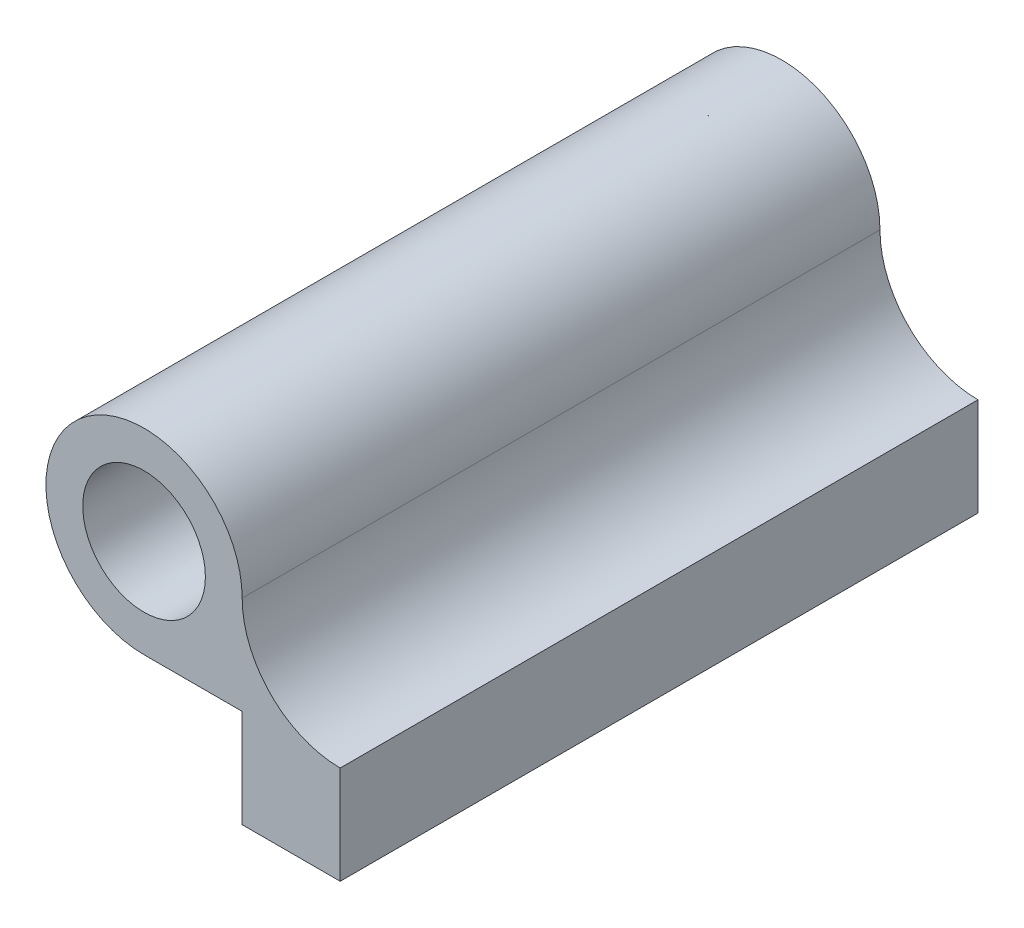
ISO-10303-21;
HEADER;
FILE_DESCRIPTION(('STEP AP214'),'2;1');
FILE_NAME('part.step','',(''),(''),'','','');
FILE_SCHEMA(('AUTOMOTIVE_DESIGN { 1 0 10303 214 1 1 1 1 }'));
ENDSEC;
DATA;
#1=APPLICATION_CONTEXT('core data for automotive mechanical design processes');
#2=APPLICATION_PROTOCOL_DEFINITION('international standard','automotive_design',2000,#1);
#3=PRODUCT_CONTEXT('',#1,'mechanical');
#4=PRODUCT('Part','Part','',(#3));
#5=PRODUCT_RELATED_PRODUCT_CATEGORY('part','',(#4));
#6=PRODUCT_DEFINITION_FORMATION('','',#4);
#7=PRODUCT_DEFINITION_CONTEXT('part definition',#1,'design');
#8=PRODUCT_DEFINITION('design','',#6,#7);
#9=PRODUCT_DEFINITION_SHAPE('','',#8);
#10=(LENGTH_UNIT() NAMED_UNIT(*) SI_UNIT(.MILLI.,.METRE.));
#11=(NAMED_UNIT(*) PLANE_ANGLE_UNIT() SI_UNIT($,.RADIAN.));
#12=(NAMED_UNIT(*) SI_UNIT($,.STERADIAN.) SOLID_ANGLE_UNIT());
#13=UNCERTAINTY_MEASURE_WITH_UNIT(LENGTH_MEASURE(1.E-05),#10,'distance_accuracy_value','');
#14=(GEOMETRIC_REPRESENTATION_CONTEXT(3) GLOBAL_UNCERTAINTY_ASSIGNED_CONTEXT((#13)) GLOBAL_UNIT_ASSIGNED_CONTEXT((#10,
#11,#12)) REPRESENTATION_CONTEXT('',''));
#15=CARTESIAN_POINT('',(0.,0.,0.));
#16=DIRECTION('',(0.,0.,1.));
#17=DIRECTION('',(1.,0.,0.));
#18=AXIS2_PLACEMENT_3D('',#15,#16,#17);
#19=CARTESIAN_POINT('',(7.33716722612504,0.000388335978682196,-11.5573838580648));
#20=DIRECTION('',(0.,0.,1.));
#21=DIRECTION('',(1.,0.,0.));
#22=AXIS2_PLACEMENT_3D('',#19,#20,#21);
#23=CYLINDRICAL_SURFACE('',#22,1.99961170172985);
#24=DIRECTION('',(0.,0.,1.));
#25=VECTOR('',#24,1.);
#26=CARTESIAN_POINT('',(7.33716722612504,2.00000001885427,-11.5573838580648));
#27=LINE('',#26,#25);
#28=CARTESIAN_POINT('',(7.33716722612504,2.,6.4428661419352));
#29=VERTEX_POINT('',#28);
#30=CARTESIAN_POINT('',(7.33716722612504,2.,-6.5571338580648));
#31=VERTEX_POINT('',#30);
#32=EDGE_CURVE('E114',#29,#31,#27,.F.);
#33=ORIENTED_EDGE('',*,*,#32,.F.);
#34=CARTESIAN_POINT('',(7.33716722612504,0.000388335978682196,6.44286614193519));
#35=DIRECTION('',(0.,0.,1.));
#36=DIRECTION('',(1.,0.,0.));
#37=AXIS2_PLACEMENT_3D('',#34,#35,#36);
#38=CIRCLE('',#37,1.99961170172985);
#39=CARTESIAN_POINT('',(7.33677889014635,2.,6.4428661419352));
#40=VERTEX_POINT('',#39);
#41=EDGE_CURVE('E50',#29,#40,#38,.T.);
#42=ORIENTED_EDGE('',*,*,#41,.T.);
#43=DIRECTION('',(0.,0.,1.));
#44=VECTOR('',#43,1.);
#45=CARTESIAN_POINT('',(7.33677889014635,2.,-16.0273685975336));
#46=LINE('',#45,#44);
#47=CARTESIAN_POINT('',(7.33677889014635,2.,-6.55713385806481));
#48=VERTEX_POINT('',#47);
#49=EDGE_CURVE('E153',#48,#40,#46,.T.);
#50=ORIENTED_EDGE('',*,*,#49,.F.);
#51=CARTESIAN_POINT('',(7.33716722612504,0.000388335978682196,-6.5571338580648));
#52=DIRECTION('',(0.,0.,-1.));
#53=DIRECTION('',(-1.,0.,0.));
#54=AXIS2_PLACEMENT_3D('',#51,#52,#53);
#55=CIRCLE('',#54,1.99961170172985);
#56=EDGE_CURVE('E174',#48,#31,#55,.T.);
#57=ORIENTED_EDGE('',*,*,#56,.T.);
#58=EDGE_LOOP('',(#33,#42,#50,#57));
#59=FACE_BOUND('',#58,.T.);
#60=ADVANCED_FACE('F42',(#59),#23,.F.);
#61=CARTESIAN_POINT('',(0.,0.,6.4428661419352));
#62=DIRECTION('',(0.,0.,1.));
#63=DIRECTION('',(1.,0.,0.));
#64=AXIS2_PLACEMENT_3D('',#61,#62,#63);
#65=PLANE('',#64);
#66=DIRECTION('',(-1.,0.,0.));
#67=VECTOR('',#66,1.);
#68=CARTESIAN_POINT('',(0.,2.,6.4428661419352));
#69=LINE('',#68,#67);
#70=CARTESIAN_POINT('',(9.33677889014635,2.,6.44286614193519));
#71=VERTEX_POINT('',#70);
#72=EDGE_CURVE('E133',#71,#29,#69,.T.);
#73=ORIENTED_EDGE('',*,*,#72,.F.);
#74=DIRECTION('',(0.,-1.,0.));
#75=VECTOR('',#74,1.);
#76=CARTESIAN_POINT('',(9.33677889014635,0.,6.4428661419352));
#77=LINE('',#76,#75);
#78=CARTESIAN_POINT('',(9.33677890900062,0.000388335978682196,6.4428661419352));
#79=VERTEX_POINT('',#78);
#80=EDGE_CURVE('E121',#71,#79,#77,.T.);
#81=ORIENTED_EDGE('',*,*,#80,.T.);
#82=CARTESIAN_POINT('',(9.33677889014637,0.,6.44286614193519));
#83=VERTEX_POINT('',#82);
#84=EDGE_CURVE('E11',#83,#79,#38,.T.);
#85=ORIENTED_EDGE('',*,*,#84,.F.);
#86=DIRECTION('',(-1.,0.,0.));
#87=VECTOR('',#86,1.);
#88=CARTESIAN_POINT('',(0.,0.,6.4428661419352));
#89=LINE('',#88,#87);
#90=CARTESIAN_POINT('',(11.334653153546,0.,6.4428661419352));
#91=VERTEX_POINT('',#90);
#92=EDGE_CURVE('E65',#91,#83,#89,.T.);
#93=ORIENTED_EDGE('',*,*,#92,.F.);
#94=DIRECTION('',(0.,-1.,0.));
#95=VECTOR('',#94,1.);
#96=CARTESIAN_POINT('',(11.334653153546,0.,6.4428661419352));
#97=LINE('',#96,#95);
#98=CARTESIAN_POINT('',(11.334653153546,2.,6.44286614193519));
#99=VERTEX_POINT('',#98);
#100=EDGE_CURVE('E146',#99,#91,#97,.T.);
#101=ORIENTED_EDGE('',*,*,#100,.F.);
#102=CARTESIAN_POINT('',(11.3367800210374,4.,6.44286614193519));
#103=DIRECTION('',(0.,0.,1.));
#104=DIRECTION('',(1.,0.,0.));
#105=AXIS2_PLACEMENT_3D('',#102,#103,#104);
#106=CIRCLE('',#105,2.00000113089101);
#107=CARTESIAN_POINT('',(9.33677889014635,4.,6.44286614193519));
#108=VERTEX_POINT('',#107);
#109=EDGE_CURVE('E152',#99,#108,#106,.F.);
#110=ORIENTED_EDGE('',*,*,#109,.T.);
#111=CARTESIAN_POINT('',(7.33677889014635,4.,6.4428661419352));
#112=DIRECTION('',(0.,0.,1.));
#113=DIRECTION('',(1.,0.,0.));
#114=AXIS2_PLACEMENT_3D('',#111,#112,#113);
#115=CIRCLE('',#114,2.);
#116=EDGE_CURVE('E156',#108,#40,#115,.T.);
#117=ORIENTED_EDGE('',*,*,#116,.T.);
#118=ORIENTED_EDGE('',*,*,#41,.F.);
#119=EDGE_LOOP('',(#73,#81,#85,#93,#101,#110,#117,#118));
#120=FACE_BOUND('',#119,.T.);
#121=CARTESIAN_POINT('',(7.33677889014635,4.,6.4428661419352));
#122=DIRECTION('',(0.,0.,1.));
#123=DIRECTION('',(1.,0.,0.));
#124=AXIS2_PLACEMENT_3D('',#121,#122,#123);
#125=CIRCLE('',#124,1.25);
#126=CARTESIAN_POINT('',(8.58677889014635,4.,6.4428661419352));
#127=VERTEX_POINT('',#126);
#128=EDGE_CURVE('E170',#127,#127,#125,.T.);
#129=ORIENTED_EDGE('',*,*,#128,.F.);
#130=EDGE_LOOP('',(#129));
#131=FACE_BOUND('',#130,.T.);
#132=ADVANCED_FACE('F44',(#120,#131),#65,.T.);
#133=CARTESIAN_POINT('',(0.,0.,-6.5571338580648));
#134=DIRECTION('',(0.,0.,-1.));
#135=DIRECTION('',(-1.,0.,0.));
#136=AXIS2_PLACEMENT_3D('',#133,#134,#135);
#137=PLANE('',#136);
#138=DIRECTION('',(1.,0.,0.));
#139=VECTOR('',#138,1.);
#140=CARTESIAN_POINT('',(0.,2.,-6.5571338580648));
#141=LINE('',#140,#139);
#142=CARTESIAN_POINT('',(9.33677889014635,2.,-6.5571338580648));
#143=VERTEX_POINT('',#142);
#144=EDGE_CURVE('E109',#31,#143,#141,.T.);
#145=ORIENTED_EDGE('',*,*,#144,.F.);
#146=ORIENTED_EDGE('',*,*,#56,.F.);
#147=CARTESIAN_POINT('',(7.33677889014635,4.,-6.55713385806481));
#148=DIRECTION('',(0.,0.,-1.));
#149=DIRECTION('',(-1.,0.,0.));
#150=AXIS2_PLACEMENT_3D('',#147,#148,#149);
#151=CIRCLE('',#150,2.);
#152=CARTESIAN_POINT('',(9.33677889014635,4.,-6.5571338580648));
#153=VERTEX_POINT('',#152);
#154=EDGE_CURVE('E164',#48,#153,#151,.T.);
#155=ORIENTED_EDGE('',*,*,#154,.T.);
#156=CARTESIAN_POINT('',(11.3367800210374,4.,-6.5571338580648));
#157=DIRECTION('',(0.,0.,-1.));
#158=DIRECTION('',(-1.,0.,0.));
#159=AXIS2_PLACEMENT_3D('',#156,#157,#158);
#160=CIRCLE('',#159,2.00000113089101);
#161=CARTESIAN_POINT('',(11.334653153546,2.,-6.5571338580648));
#162=VERTEX_POINT('',#161);
#163=EDGE_CURVE('E149',#153,#162,#160,.F.);
#164=ORIENTED_EDGE('',*,*,#163,.T.);
#165=DIRECTION('',(0.,-1.,0.));
#166=VECTOR('',#165,1.);
#167=CARTESIAN_POINT('',(11.334653153546,10.,-6.5571338580648));
#168=LINE('',#167,#166);
#169=CARTESIAN_POINT('',(11.334653153546,0.,-6.5571338580648));
#170=VERTEX_POINT('',#169);
#171=EDGE_CURVE('E143',#162,#170,#168,.T.);
#172=ORIENTED_EDGE('',*,*,#171,.T.);
#173=DIRECTION('',(1.,0.,0.));
#174=VECTOR('',#173,1.);
#175=CARTESIAN_POINT('',(0.,0.,-6.5571338580648));
#176=LINE('',#175,#174);
#177=CARTESIAN_POINT('',(9.33677889014637,0.,-6.5571338580648));
#178=VERTEX_POINT('',#177);
#179=EDGE_CURVE('E138',#178,#170,#176,.T.);
#180=ORIENTED_EDGE('',*,*,#179,.F.);
#181=CARTESIAN_POINT('',(9.33677892785489,0.000388335978682196,-6.5571338580648));
#182=VERTEX_POINT('',#181);
#183=EDGE_CURVE('E128',#182,#178,#55,.T.);
#184=ORIENTED_EDGE('',*,*,#183,.F.);
#185=DIRECTION('',(0.,1.,0.));
#186=VECTOR('',#185,1.);
#187=CARTESIAN_POINT('',(9.33677889014635,0.,-6.5571338580648));
#188=LINE('',#187,#186);
#189=EDGE_CURVE('E57',#182,#143,#188,.T.);
#190=ORIENTED_EDGE('',*,*,#189,.T.);
#191=EDGE_LOOP('',(#145,#146,#155,#164,#172,#180,#184,#190));
#192=FACE_BOUND('',#191,.T.);
#193=CARTESIAN_POINT('',(7.33677889014635,4.,-6.55713385806481));
#194=DIRECTION('',(0.,0.,-1.));
#195=DIRECTION('',(-1.,0.,0.));
#196=AXIS2_PLACEMENT_3D('',#193,#194,#195);
#197=CIRCLE('',#196,1.25);
#198=CARTESIAN_POINT('',(6.08677889014635,4.,-6.55713385806481));
#199=VERTEX_POINT('',#198);
#200=EDGE_CURVE('E167',#199,#199,#197,.T.);
#201=ORIENTED_EDGE('',*,*,#200,.F.);
#202=EDGE_LOOP('',(#201));
#203=FACE_BOUND('',#202,.T.);
#204=ADVANCED_FACE('F125',(#192,#203),#137,.T.);
#205=ORIENTED_EDGE('',*,*,#84,.T.);
#206=DIRECTION('',(0.,0.,1.));
#207=VECTOR('',#206,1.);
#208=CARTESIAN_POINT('',(9.33677890900062,0.000388335978682196,-11.5573838580648));
#209=LINE('',#208,#207);
#210=EDGE_CURVE('E122',#79,#182,#209,.F.);
#211=ORIENTED_EDGE('',*,*,#210,.T.);
#212=ORIENTED_EDGE('',*,*,#183,.T.);
#213=DIRECTION('',(0.,0.,-1.));
#214=VECTOR('',#213,1.);
#215=CARTESIAN_POINT('',(9.33677889014637,0.,-6.5571338580648));
#216=LINE('',#215,#214);
#217=EDGE_CURVE('E141',#83,#178,#216,.T.);
#218=ORIENTED_EDGE('',*,*,#217,.F.);
#219=EDGE_LOOP('',(#205,#211,#212,#218));
#220=FACE_BOUND('',#219,.T.);
#221=ADVANCED_FACE('F178',(#220),#23,.F.);
#222=CARTESIAN_POINT('',(7.33677889014635,4.,-40.2139881075572));
#223=DIRECTION('',(0.,0.,1.));
#224=DIRECTION('',(1.,0.,0.));
#225=AXIS2_PLACEMENT_3D('',#222,#223,#224);
#226=CYLINDRICAL_SURFACE('',#225,2.);
#227=ORIENTED_EDGE('',*,*,#154,.F.);
#228=ORIENTED_EDGE('',*,*,#49,.T.);
#229=ORIENTED_EDGE('',*,*,#116,.F.);
#230=DIRECTION('',(0.,0.,1.));
#231=VECTOR('',#230,1.);
#232=CARTESIAN_POINT('',(9.33677889014635,4.,-16.0273685975336));
#233=LINE('',#232,#231);
#234=EDGE_CURVE('E159',#153,#108,#233,.T.);
#235=ORIENTED_EDGE('',*,*,#234,.F.);
#236=EDGE_LOOP('',(#227,#228,#229,#235));
#237=FACE_BOUND('',#236,.T.);
#238=ADVANCED_FACE('F194',(#237),#226,.T.);
#239=CARTESIAN_POINT('',(7.33677889014635,4.,-40.2139881075572));
#240=DIRECTION('',(0.,0.,1.));
#241=DIRECTION('',(1.,0.,0.));
#242=AXIS2_PLACEMENT_3D('',#239,#240,#241);
#243=CYLINDRICAL_SURFACE('',#242,1.25);
#244=ORIENTED_EDGE('',*,*,#200,.T.);
#245=EDGE_LOOP('',(#244));
#246=FACE_BOUND('',#245,.T.);
#247=ORIENTED_EDGE('',*,*,#128,.T.);
#248=EDGE_LOOP('',(#247));
#249=FACE_BOUND('',#248,.T.);
#250=ADVANCED_FACE('F196',(#246,#249),#243,.F.);
#251=CARTESIAN_POINT('',(11.3367800210374,4.,-16.0273685975336));
#252=DIRECTION('',(0.,0.,1.));
#253=DIRECTION('',(1.,0.,0.));
#254=AXIS2_PLACEMENT_3D('',#251,#252,#253);
#255=CYLINDRICAL_SURFACE('',#254,2.00000113089101);
#256=ORIENTED_EDGE('',*,*,#109,.F.);
#257=DIRECTION('',(0.,0.,1.));
#258=VECTOR('',#257,1.);
#259=CARTESIAN_POINT('',(11.334653153546,2.,-16.0273685975336));
#260=LINE('',#259,#258);
#261=EDGE_CURVE('E157',#162,#99,#260,.T.);
#262=ORIENTED_EDGE('',*,*,#261,.F.);
#263=ORIENTED_EDGE('',*,*,#163,.F.);
#264=ORIENTED_EDGE('',*,*,#234,.T.);
#265=EDGE_LOOP('',(#256,#262,#263,#264));
#266=FACE_BOUND('',#265,.T.);
#267=ADVANCED_FACE('F189',(#266),#255,.F.);
#268=CARTESIAN_POINT('',(11.334653153546,10.,-6.5571338580648));
#269=DIRECTION('',(-1.,0.,0.));
#270=DIRECTION('',(0.,0.,1.));
#271=AXIS2_PLACEMENT_3D('',#268,#269,#270);
#272=PLANE('',#271);
#273=ORIENTED_EDGE('',*,*,#100,.T.);
#274=DIRECTION('',(0.,0.,1.));
#275=VECTOR('',#274,1.);
#276=CARTESIAN_POINT('',(11.334653153546,0.,11.4428661419352));
#277=LINE('',#276,#275);
#278=EDGE_CURVE('E135',#170,#91,#277,.T.);
#279=ORIENTED_EDGE('',*,*,#278,.F.);
#280=ORIENTED_EDGE('',*,*,#171,.F.);
#281=ORIENTED_EDGE('',*,*,#261,.T.);
#282=EDGE_LOOP('',(#273,#279,#280,#281));
#283=FACE_BOUND('',#282,.T.);
#284=ADVANCED_FACE('F185',(#283),#272,.F.);
#285=CARTESIAN_POINT('',(1.33465315354599,0.,11.4428661419352));
#286=DIRECTION('',(0.,1.,0.));
#287=DIRECTION('',(0.,0.,1.));
#288=AXIS2_PLACEMENT_3D('',#285,#286,#287);
#289=PLANE('',#288);
#290=ORIENTED_EDGE('',*,*,#92,.T.);
#291=ORIENTED_EDGE('',*,*,#217,.T.);
#292=ORIENTED_EDGE('',*,*,#179,.T.);
#293=ORIENTED_EDGE('',*,*,#278,.T.);
#294=EDGE_LOOP('',(#290,#291,#292,#293));
#295=FACE_BOUND('',#294,.T.);
#296=ADVANCED_FACE('F180',(#295),#289,.F.);
#297=CARTESIAN_POINT('',(0.,2.,0.));
#298=DIRECTION('',(0.,1.,0.));
#299=DIRECTION('',(0.,0.,1.));
#300=AXIS2_PLACEMENT_3D('',#297,#298,#299);
#301=PLANE('',#300);
#302=ORIENTED_EDGE('',*,*,#72,.T.);
#303=ORIENTED_EDGE('',*,*,#32,.T.);
#304=ORIENTED_EDGE('',*,*,#144,.T.);
#305=DIRECTION('',(0.,0.,1.));
#306=VECTOR('',#305,1.);
#307=CARTESIAN_POINT('',(9.33677889014635,2.,-11.5571338580648));
#308=LINE('',#307,#306);
#309=EDGE_CURVE('E111',#143,#71,#308,.T.);
#310=ORIENTED_EDGE('',*,*,#309,.T.);
#311=EDGE_LOOP('',(#302,#303,#304,#310));
#312=FACE_BOUND('',#311,.T.);
#313=ADVANCED_FACE('F110',(#312),#301,.F.);
#314=CARTESIAN_POINT('',(9.33677889014635,-23.3451019965122,-11.5571338580648));
#315=DIRECTION('',(-1.,0.,0.));
#316=DIRECTION('',(0.,0.,1.));
#317=AXIS2_PLACEMENT_3D('',#314,#315,#316);
#318=PLANE('',#317);
#319=ORIENTED_EDGE('',*,*,#210,.F.);
#320=ORIENTED_EDGE('',*,*,#80,.F.);
#321=ORIENTED_EDGE('',*,*,#309,.F.);
#322=ORIENTED_EDGE('',*,*,#189,.F.);
#323=EDGE_LOOP('',(#319,#320,#321,#322));
#324=FACE_BOUND('',#323,.T.);
#325=ADVANCED_FACE('F119',(#324),#318,.T.);
#326=CLOSED_SHELL('',(#60,#132,#204,#221,#238,#250,#267,#284,#296,#313,#325));
#327=MANIFOLD_SOLID_BREP('B2',#326);
#328=ADVANCED_BREP_SHAPE_REPRESENTATION('',(#18,#327),#14);
#329=SHAPE_DEFINITION_REPRESENTATION(#9,#328);
ENDSEC;
END-ISO-10303-21;
